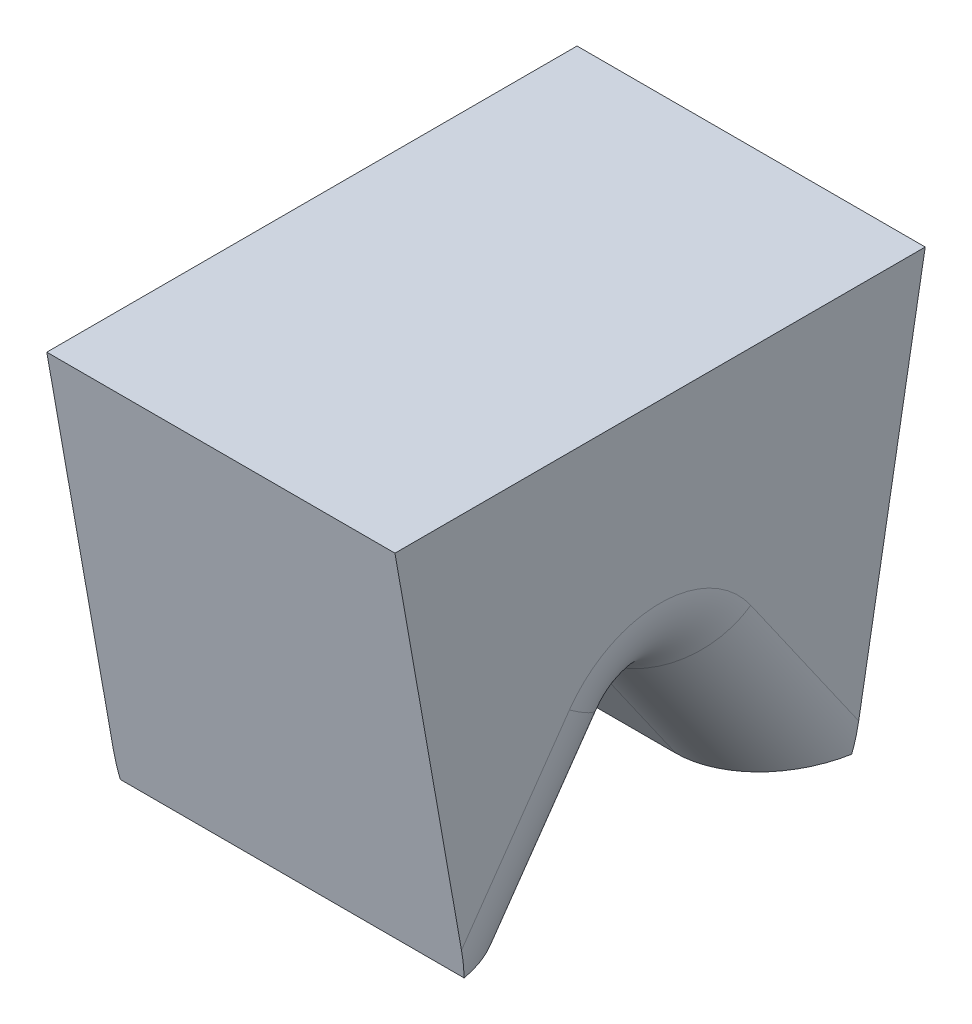
ISO-10303-21;
HEADER;
FILE_DESCRIPTION(('STEP AP214'),'2;1');
FILE_NAME('part.step','',(''),(''),'','','');
FILE_SCHEMA(('AUTOMOTIVE_DESIGN { 1 0 10303 214 1 1 1 1 }'));
ENDSEC;
DATA;
#1=APPLICATION_CONTEXT('core data for automotive mechanical design processes');
#2=APPLICATION_PROTOCOL_DEFINITION('international standard','automotive_design',2000,#1);
#3=PRODUCT_CONTEXT('',#1,'mechanical');
#4=PRODUCT('Part','Part','',(#3));
#5=PRODUCT_RELATED_PRODUCT_CATEGORY('part','',(#4));
#6=PRODUCT_DEFINITION_FORMATION('','',#4);
#7=PRODUCT_DEFINITION_CONTEXT('part definition',#1,'design');
#8=PRODUCT_DEFINITION('design','',#6,#7);
#9=PRODUCT_DEFINITION_SHAPE('','',#8);
#10=(LENGTH_UNIT() NAMED_UNIT(*) SI_UNIT(.MILLI.,.METRE.));
#11=(NAMED_UNIT(*) PLANE_ANGLE_UNIT() SI_UNIT($,.RADIAN.));
#12=(NAMED_UNIT(*) SI_UNIT($,.STERADIAN.) SOLID_ANGLE_UNIT());
#13=UNCERTAINTY_MEASURE_WITH_UNIT(LENGTH_MEASURE(1.E-05),#10,'distance_accuracy_value','');
#14=(GEOMETRIC_REPRESENTATION_CONTEXT(3) GLOBAL_UNCERTAINTY_ASSIGNED_CONTEXT((#13)) GLOBAL_UNIT_ASSIGNED_CONTEXT((#10,
#11,#12)) REPRESENTATION_CONTEXT('',''));
#15=CARTESIAN_POINT('',(0.,0.,0.));
#16=DIRECTION('',(0.,0.,1.));
#17=DIRECTION('',(1.,0.,0.));
#18=AXIS2_PLACEMENT_3D('',#15,#16,#17);
#19=CARTESIAN_POINT('',(0.,0.835526315789467,0.));
#20=DIRECTION('',(0.,1.,0.));
#21=DIRECTION('',(0.,0.,1.));
#22=AXIS2_PLACEMENT_3D('',#19,#20,#21);
#23=PLANE('',#22);
#24=DIRECTION('',(0.,0.,-1.));
#25=VECTOR('',#24,1.);
#26=CARTESIAN_POINT('',(-0.36068,0.835526315789467,1.50859998));
#27=LINE('',#26,#25);
#28=CARTESIAN_POINT('',(-0.36068,0.835526315789467,0.547375832565625));
#29=VERTEX_POINT('',#28);
#30=CARTESIAN_POINT('',(-0.36068,0.835526315789467,-0.547375832565625));
#31=VERTEX_POINT('',#30);
#32=EDGE_CURVE('E142',#29,#31,#27,.T.);
#33=ORIENTED_EDGE('',*,*,#32,.F.);
#34=DIRECTION('',(-1.,0.,0.));
#35=VECTOR('',#34,1.);
#36=CARTESIAN_POINT('',(1.50859998,0.835526315789467,0.547375832565625));
#37=LINE('',#36,#35);
#38=CARTESIAN_POINT('',(0.35814,0.835526315789467,0.547375832565625));
#39=VERTEX_POINT('',#38);
#40=EDGE_CURVE('E57',#39,#29,#37,.T.);
#41=ORIENTED_EDGE('',*,*,#40,.F.);
#42=DIRECTION('',(0.,0.,1.));
#43=VECTOR('',#42,1.);
#44=CARTESIAN_POINT('',(0.35814,0.835526315789467,1.50859998));
#45=LINE('',#44,#43);
#46=CARTESIAN_POINT('',(0.35814,0.835526315789467,-0.547375832565625));
#47=VERTEX_POINT('',#46);
#48=EDGE_CURVE('E12',#47,#39,#45,.T.);
#49=ORIENTED_EDGE('',*,*,#48,.F.);
#50=DIRECTION('',(1.,0.,0.));
#51=VECTOR('',#50,1.);
#52=CARTESIAN_POINT('',(1.50859998,0.835526315789467,-0.547375832565625));
#53=LINE('',#52,#51);
#54=EDGE_CURVE('E129',#31,#47,#53,.T.);
#55=ORIENTED_EDGE('',*,*,#54,.F.);
#56=EDGE_LOOP('',(#33,#41,#49,#55));
#57=FACE_BOUND('',#56,.T.);
#58=ADVANCED_FACE('F42',(#57),#23,.T.);
#59=CARTESIAN_POINT('',(1.50859998,0.,-0.40005));
#60=DIRECTION('',(0.,-0.173648177666931,-0.984807753012208));
#61=DIRECTION('',(0.,0.984807753012208,-0.173648177666931));
#62=AXIS2_PLACEMENT_3D('',#59,#60,#61);
#63=PLANE('',#62);
#64=DIRECTION('',(0.,0.984807753012208,-0.173648177666931));
#65=VECTOR('',#64,1.);
#66=CARTESIAN_POINT('',(-0.36068,0.,-0.40005));
#67=LINE('',#66,#65);
#68=CARTESIAN_POINT('',(-0.36068,0.0567663634848456,-0.410059441479082));
#69=VERTEX_POINT('',#68);
#70=EDGE_CURVE('E141',#69,#31,#67,.T.);
#71=ORIENTED_EDGE('',*,*,#70,.T.);
#72=ORIENTED_EDGE('',*,*,#54,.T.);
#73=DIRECTION('',(0.,-0.984807753012208,0.173648177666931));
#74=VECTOR('',#73,1.);
#75=CARTESIAN_POINT('',(0.35814,0.,-0.40005));
#76=LINE('',#75,#74);
#77=CARTESIAN_POINT('',(0.35814,0.0567663634848456,-0.410059441479082));
#78=VERTEX_POINT('',#77);
#79=EDGE_CURVE('E138',#47,#78,#76,.T.);
#80=ORIENTED_EDGE('',*,*,#79,.T.);
#81=CARTESIAN_POINT('',(0.17018,0.0567663634848455,-0.410059441479082));
#82=DIRECTION('',(0.,-0.173648177666931,-0.984807753012208));
#83=DIRECTION('',(0.,-0.984807753012208,0.173648177666931));
#84=AXIS2_PLACEMENT_3D('',#81,#82,#83);
#85=ELLIPSE('',#84,0.265815581183647,0.18796);
#86=CARTESIAN_POINT('',(0.353667484938324,0.,-0.40005));
#87=VERTEX_POINT('',#86);
#88=EDGE_CURVE('E250',#78,#87,#85,.T.);
#89=ORIENTED_EDGE('',*,*,#88,.T.);
#90=DIRECTION('',(-1.,0.,0.));
#91=VECTOR('',#90,1.);
#92=CARTESIAN_POINT('',(1.50859998,0.,-0.40005));
#93=LINE('',#92,#91);
#94=CARTESIAN_POINT('',(-0.356207484938324,0.,-0.40005));
#95=VERTEX_POINT('',#94);
#96=EDGE_CURVE('E157',#87,#95,#93,.T.);
#97=ORIENTED_EDGE('',*,*,#96,.T.);
#98=CARTESIAN_POINT('',(-0.17272,0.0567663634848455,-0.410059441479082));
#99=DIRECTION('',(0.,-0.173648177666931,-0.984807753012208));
#100=DIRECTION('',(0.,0.984807753012208,-0.173648177666931));
#101=AXIS2_PLACEMENT_3D('',#98,#99,#100);
#102=ELLIPSE('',#101,0.265815581183647,0.18796);
#103=EDGE_CURVE('E243',#95,#69,#102,.T.);
#104=ORIENTED_EDGE('',*,*,#103,.T.);
#105=EDGE_LOOP('',(#71,#72,#80,#89,#97,#104));
#106=FACE_BOUND('',#105,.T.);
#107=ADVANCED_FACE('F137',(#106),#63,.T.);
#108=CARTESIAN_POINT('',(1.50859998,0.,0.40005));
#109=DIRECTION('',(0.,-0.173648177666931,0.984807753012208));
#110=DIRECTION('',(0.,-0.984807753012208,-0.173648177666931));
#111=AXIS2_PLACEMENT_3D('',#108,#109,#110);
#112=PLANE('',#111);
#113=DIRECTION('',(0.,0.984807753012208,0.173648177666931));
#114=VECTOR('',#113,1.);
#115=CARTESIAN_POINT('',(0.35814,0.,0.40005));
#116=LINE('',#115,#114);
#117=CARTESIAN_POINT('',(0.35814,0.0567663634848455,0.410059441479082));
#118=VERTEX_POINT('',#117);
#119=EDGE_CURVE('E148',#118,#39,#116,.T.);
#120=ORIENTED_EDGE('',*,*,#119,.T.);
#121=ORIENTED_EDGE('',*,*,#40,.T.);
#122=DIRECTION('',(0.,-0.984807753012208,-0.173648177666931));
#123=VECTOR('',#122,1.);
#124=CARTESIAN_POINT('',(-0.36068,0.,0.40005));
#125=LINE('',#124,#123);
#126=CARTESIAN_POINT('',(-0.36068,0.0567663634848455,0.410059441479082));
#127=VERTEX_POINT('',#126);
#128=EDGE_CURVE('E159',#29,#127,#125,.T.);
#129=ORIENTED_EDGE('',*,*,#128,.T.);
#130=CARTESIAN_POINT('',(-0.17272,0.0567663634848455,0.410059441479082));
#131=DIRECTION('',(0.,-0.173648177666931,0.984807753012208));
#132=DIRECTION('',(0.,-0.984807753012208,-0.173648177666931));
#133=AXIS2_PLACEMENT_3D('',#130,#131,#132);
#134=ELLIPSE('',#133,0.265815581183647,0.18796);
#135=CARTESIAN_POINT('',(-0.356207484938324,0.,0.40005));
#136=VERTEX_POINT('',#135);
#137=EDGE_CURVE('E297',#127,#136,#134,.T.);
#138=ORIENTED_EDGE('',*,*,#137,.T.);
#139=DIRECTION('',(-1.,0.,0.));
#140=VECTOR('',#139,1.);
#141=CARTESIAN_POINT('',(1.50859998,0.,0.40005));
#142=LINE('',#141,#140);
#143=CARTESIAN_POINT('',(0.353667484938324,0.,0.40005));
#144=VERTEX_POINT('',#143);
#145=EDGE_CURVE('E150',#144,#136,#142,.T.);
#146=ORIENTED_EDGE('',*,*,#145,.F.);
#147=CARTESIAN_POINT('',(0.17018,0.0567663634848455,0.410059441479082));
#148=DIRECTION('',(0.,-0.173648177666931,0.984807753012208));
#149=DIRECTION('',(0.,0.984807753012208,0.173648177666931));
#150=AXIS2_PLACEMENT_3D('',#147,#148,#149);
#151=ELLIPSE('',#150,0.265815581183647,0.18796);
#152=EDGE_CURVE('E261',#144,#118,#151,.T.);
#153=ORIENTED_EDGE('',*,*,#152,.T.);
#154=EDGE_LOOP('',(#120,#121,#129,#138,#146,#153));
#155=FACE_BOUND('',#154,.T.);
#156=ADVANCED_FACE('F212',(#155),#112,.T.);
#157=CARTESIAN_POINT('',(-0.36068,1.02124002,1.50859998));
#158=DIRECTION('',(-1.,0.,0.));
#159=DIRECTION('',(0.,-1.,0.));
#160=AXIS2_PLACEMENT_3D('',#157,#158,#159);
#161=PLANE('',#160);
#162=ORIENTED_EDGE('',*,*,#128,.F.);
#163=ORIENTED_EDGE('',*,*,#32,.T.);
#164=ORIENTED_EDGE('',*,*,#70,.F.);
#165=DIRECTION('',(0.,-0.819152044288993,-0.573576436351044));
#166=VECTOR('',#165,1.);
#167=CARTESIAN_POINT('',(-0.36068,0.374959573349849,-0.187258157324464));
#168=LINE('',#167,#166);
#169=CARTESIAN_POINT('',(-0.36068,0.374959573349848,-0.187258157324464));
#170=VERTEX_POINT('',#169);
#171=EDGE_CURVE('E305',#69,#170,#168,.F.);
#172=ORIENTED_EDGE('',*,*,#171,.T.);
#173=CARTESIAN_POINT('',(-0.36068,0.24384,0.));
#174=DIRECTION('',(-1.,0.,0.));
#175=DIRECTION('',(0.,-1.,0.));
#176=AXIS2_PLACEMENT_3D('',#173,#174,#175);
#177=CIRCLE('',#176,0.2286);
#178=CARTESIAN_POINT('',(-0.36068,0.374959573349849,0.187258157324464));
#179=VERTEX_POINT('',#178);
#180=EDGE_CURVE('E303',#170,#179,#177,.F.);
#181=ORIENTED_EDGE('',*,*,#180,.T.);
#182=DIRECTION('',(0.,0.819152044288993,-0.573576436351044));
#183=VECTOR('',#182,1.);
#184=CARTESIAN_POINT('',(-0.36068,0.107809426976543,0.374318703648879));
#185=LINE('',#184,#183);
#186=EDGE_CURVE('E300',#179,#127,#185,.F.);
#187=ORIENTED_EDGE('',*,*,#186,.T.);
#188=EDGE_LOOP('',(#162,#163,#164,#172,#181,#187));
#189=FACE_BOUND('',#188,.T.);
#190=ADVANCED_FACE('F330',(#189),#161,.T.);
#191=CARTESIAN_POINT('',(0.35814,-0.00999998,1.50859998));
#192=DIRECTION('',(1.,0.,0.));
#193=DIRECTION('',(0.,1.,0.));
#194=AXIS2_PLACEMENT_3D('',#191,#192,#193);
#195=PLANE('',#194);
#196=ORIENTED_EDGE('',*,*,#79,.F.);
#197=ORIENTED_EDGE('',*,*,#48,.T.);
#198=ORIENTED_EDGE('',*,*,#119,.F.);
#199=DIRECTION('',(0.,-0.819152044288993,0.573576436351044));
#200=VECTOR('',#199,1.);
#201=CARTESIAN_POINT('',(0.35814,0.374959573349849,0.187258157324464));
#202=LINE('',#201,#200);
#203=CARTESIAN_POINT('',(0.35814,0.374959573349849,0.187258157324464));
#204=VERTEX_POINT('',#203);
#205=EDGE_CURVE('E247',#118,#204,#202,.F.);
#206=ORIENTED_EDGE('',*,*,#205,.T.);
#207=CARTESIAN_POINT('',(0.35814,0.24384,0.));
#208=DIRECTION('',(1.,0.,0.));
#209=DIRECTION('',(0.,1.,0.));
#210=AXIS2_PLACEMENT_3D('',#207,#208,#209);
#211=CIRCLE('',#210,0.2286);
#212=CARTESIAN_POINT('',(0.35814,0.374959573349849,-0.187258157324464));
#213=VERTEX_POINT('',#212);
#214=EDGE_CURVE('E242',#204,#213,#211,.F.);
#215=ORIENTED_EDGE('',*,*,#214,.T.);
#216=DIRECTION('',(0.,0.819152044288993,0.573576436351044));
#217=VECTOR('',#216,1.);
#218=CARTESIAN_POINT('',(0.35814,0.107809426976542,-0.37431870364888));
#219=LINE('',#218,#217);
#220=EDGE_CURVE('E146',#213,#78,#219,.F.);
#221=ORIENTED_EDGE('',*,*,#220,.T.);
#222=EDGE_LOOP('',(#196,#197,#198,#206,#215,#221));
#223=FACE_BOUND('',#222,.T.);
#224=ADVANCED_FACE('F144',(#223),#195,.T.);
#225=CARTESIAN_POINT('',(0.,0.,0.));
#226=DIRECTION('',(0.,1.,0.));
#227=DIRECTION('',(0.,0.,1.));
#228=AXIS2_PLACEMENT_3D('',#225,#226,#227);
#229=PLANE('',#228);
#230=ORIENTED_EDGE('',*,*,#96,.F.);
#231=CARTESIAN_POINT('',(0.17018,0.,-0.449807677107923));
#232=DIRECTION('',(0.,1.,0.));
#233=DIRECTION('',(0.,0.,-1.));
#234=AXIS2_PLACEMENT_3D('',#231,#232,#233);
#235=ELLIPSE('',#234,0.229456791703603,0.18796);
#236=CARTESIAN_POINT('',(0.17018,0.,-0.22035088540432));
#237=VERTEX_POINT('',#236);
#238=EDGE_CURVE('E252',#87,#237,#235,.F.);
#239=ORIENTED_EDGE('',*,*,#238,.T.);
#240=CARTESIAN_POINT('',(0.17018,0.,-0.22035088540432));
#241=DIRECTION('',(-1.,0.,0.));
#242=VECTOR('',#241,1.);
#243=LINE('',#240,#242);
#244=CARTESIAN_POINT('',(-0.17272,0.,-0.22035088540432));
#245=VERTEX_POINT('',#244);
#246=EDGE_CURVE('E237',#237,#245,#243,.T.);
#247=ORIENTED_EDGE('',*,*,#246,.T.);
#248=CARTESIAN_POINT('',(-0.17272,0.,-0.449807677107923));
#249=DIRECTION('',(0.,1.,0.));
#250=DIRECTION('',(0.,0.,1.));
#251=AXIS2_PLACEMENT_3D('',#248,#249,#250);
#252=ELLIPSE('',#251,0.229456791703603,0.18796);
#253=EDGE_CURVE('E282',#245,#95,#252,.F.);
#254=ORIENTED_EDGE('',*,*,#253,.T.);
#255=EDGE_LOOP('',(#230,#239,#247,#254));
#256=FACE_BOUND('',#255,.T.);
#257=ADVANCED_FACE('F180',(#256),#229,.F.);
#258=CARTESIAN_POINT('',(-0.172720000000001,0.,0.22035088540432));
#259=DIRECTION('',(1.,0.,0.));
#260=VECTOR('',#259,1.);
#261=LINE('',#258,#260);
#262=CARTESIAN_POINT('',(-0.172720000000001,0.,0.22035088540432));
#263=VERTEX_POINT('',#262);
#264=CARTESIAN_POINT('',(0.17018,0.,0.22035088540432));
#265=VERTEX_POINT('',#264);
#266=EDGE_CURVE('E161',#263,#265,#261,.T.);
#267=ORIENTED_EDGE('',*,*,#266,.T.);
#268=CARTESIAN_POINT('',(0.17018,0.,0.449807677107923));
#269=DIRECTION('',(0.,1.,0.));
#270=DIRECTION('',(0.,0.,-1.));
#271=AXIS2_PLACEMENT_3D('',#268,#269,#270);
#272=ELLIPSE('',#271,0.229456791703603,0.18796);
#273=EDGE_CURVE('E64',#265,#144,#272,.F.);
#274=ORIENTED_EDGE('',*,*,#273,.T.);
#275=ORIENTED_EDGE('',*,*,#145,.T.);
#276=CARTESIAN_POINT('',(-0.17272,0.,0.449807677107923));
#277=DIRECTION('',(0.,1.,0.));
#278=DIRECTION('',(0.,0.,1.));
#279=AXIS2_PLACEMENT_3D('',#276,#277,#278);
#280=ELLIPSE('',#279,0.229456791703603,0.18796);
#281=EDGE_CURVE('E293',#136,#263,#280,.F.);
#282=ORIENTED_EDGE('',*,*,#281,.T.);
#283=EDGE_LOOP('',(#267,#274,#275,#282));
#284=FACE_BOUND('',#283,.T.);
#285=ADVANCED_FACE('F169',(#284),#229,.F.);
#286=CARTESIAN_POINT('',(-1.20142,0.267150146373306,-0.0332903390799046));
#287=DIRECTION('',(0.,0.573576436351044,-0.819152044288993));
#288=DIRECTION('',(0.,0.819152044288993,0.573576436351044));
#289=AXIS2_PLACEMENT_3D('',#286,#287,#288);
#290=PLANE('',#289);
#291=ORIENTED_EDGE('',*,*,#246,.F.);
#292=DIRECTION('',(0.,0.819152044288993,0.573576436351044));
#293=VECTOR('',#292,1.);
#294=CARTESIAN_POINT('',(0.17018,0.267150146373306,-0.0332903390799047));
#295=LINE('',#294,#293);
#296=CARTESIAN_POINT('',(0.17018,0.267150146373306,-0.0332903390799046));
#297=VERTEX_POINT('',#296);
#298=EDGE_CURVE('E240',#237,#297,#295,.T.);
#299=ORIENTED_EDGE('',*,*,#298,.T.);
#300=DIRECTION('',(1.,0.,0.));
#301=VECTOR('',#300,1.);
#302=CARTESIAN_POINT('',(-1.20142,0.267150146373306,-0.0332903390799046));
#303=LINE('',#302,#301);
#304=CARTESIAN_POINT('',(-0.17272,0.267150146373306,-0.0332903390799046));
#305=VERTEX_POINT('',#304);
#306=EDGE_CURVE('E279',#305,#297,#303,.T.);
#307=ORIENTED_EDGE('',*,*,#306,.F.);
#308=DIRECTION('',(0.,-0.819152044288993,-0.573576436351044));
#309=VECTOR('',#308,1.);
#310=CARTESIAN_POINT('',(-0.17272,0.,-0.22035088540432));
#311=LINE('',#310,#309);
#312=EDGE_CURVE('E287',#305,#245,#311,.T.);
#313=ORIENTED_EDGE('',*,*,#312,.T.);
#314=EDGE_LOOP('',(#291,#299,#307,#313));
#315=FACE_BOUND('',#314,.T.);
#316=ADVANCED_FACE('F179',(#315),#290,.F.);
#317=CARTESIAN_POINT('',(-1.20142,-0.00999998000000014,0.227352946782267));
#318=DIRECTION('',(0.,0.573576436351044,0.819152044288993));
#319=DIRECTION('',(0.,-0.819152044288993,0.573576436351044));
#320=AXIS2_PLACEMENT_3D('',#317,#318,#319);
#321=PLANE('',#320);
#322=DIRECTION('',(1.,0.,0.));
#323=VECTOR('',#322,1.);
#324=CARTESIAN_POINT('',(-1.20142,0.267150146373306,0.0332903390799046));
#325=LINE('',#324,#323);
#326=CARTESIAN_POINT('',(-0.17272,0.267150146373306,0.0332903390799046));
#327=VERTEX_POINT('',#326);
#328=CARTESIAN_POINT('',(0.17018,0.267150146373306,0.0332903390799046));
#329=VERTEX_POINT('',#328);
#330=EDGE_CURVE('E152',#327,#329,#325,.T.);
#331=ORIENTED_EDGE('',*,*,#330,.T.);
#332=DIRECTION('',(0.,-0.819152044288993,0.573576436351044));
#333=VECTOR('',#332,1.);
#334=CARTESIAN_POINT('',(0.17018,0.,0.22035088540432));
#335=LINE('',#334,#333);
#336=EDGE_CURVE('E254',#329,#265,#335,.T.);
#337=ORIENTED_EDGE('',*,*,#336,.T.);
#338=ORIENTED_EDGE('',*,*,#266,.F.);
#339=DIRECTION('',(0.,0.819152044288993,-0.573576436351044));
#340=VECTOR('',#339,1.);
#341=CARTESIAN_POINT('',(-0.17272,0.267150146373307,0.0332903390799044));
#342=LINE('',#341,#340);
#343=EDGE_CURVE('E307',#263,#327,#342,.T.);
#344=ORIENTED_EDGE('',*,*,#343,.T.);
#345=EDGE_LOOP('',(#331,#337,#338,#344));
#346=FACE_BOUND('',#345,.T.);
#347=ADVANCED_FACE('F217',(#346),#321,.F.);
#348=CARTESIAN_POINT('',(-1.20142,0.24384,0.));
#349=DIRECTION('',(1.,0.,0.));
#350=DIRECTION('',(0.,0.,-1.));
#351=AXIS2_PLACEMENT_3D('',#348,#349,#350);
#352=CYLINDRICAL_SURFACE('',#351,0.0406399999999999);
#353=ORIENTED_EDGE('',*,*,#306,.T.);
#354=CARTESIAN_POINT('',(0.17018,0.24384,0.));
#355=DIRECTION('',(1.,0.,0.));
#356=DIRECTION('',(0.,1.,0.));
#357=AXIS2_PLACEMENT_3D('',#354,#355,#356);
#358=CIRCLE('',#357,0.0406399999999999);
#359=EDGE_CURVE('E50',#297,#329,#358,.T.);
#360=ORIENTED_EDGE('',*,*,#359,.T.);
#361=ORIENTED_EDGE('',*,*,#330,.F.);
#362=CARTESIAN_POINT('',(-0.17272,0.24384,0.));
#363=DIRECTION('',(-1.,0.,0.));
#364=DIRECTION('',(0.,-1.,0.));
#365=AXIS2_PLACEMENT_3D('',#362,#363,#364);
#366=CIRCLE('',#365,0.0406399999999999);
#367=EDGE_CURVE('E291',#327,#305,#366,.T.);
#368=ORIENTED_EDGE('',*,*,#367,.T.);
#369=EDGE_LOOP('',(#353,#360,#361,#368));
#370=FACE_BOUND('',#369,.T.);
#371=ADVANCED_FACE('F194',(#370),#352,.F.);
#372=CARTESIAN_POINT('',(-0.17272,0.374959573349849,-0.187258157324464));
#373=DIRECTION('',(0.,0.819152044288993,0.573576436351044));
#374=DIRECTION('',(0.,-0.573576436351044,0.819152044288993));
#375=AXIS2_PLACEMENT_3D('',#372,#373,#374);
#376=CYLINDRICAL_SURFACE('',#375,0.18796);
#377=ORIENTED_EDGE('',*,*,#253,.F.);
#378=ORIENTED_EDGE('',*,*,#312,.F.);
#379=CARTESIAN_POINT('',(-0.17272,0.374959573349848,-0.187258157324464));
#380=DIRECTION('',(0.,0.819152044288994,0.573576436351043));
#381=DIRECTION('',(0.,-0.573576436351043,0.819152044288994));
#382=AXIS2_PLACEMENT_3D('',#379,#380,#381);
#383=CIRCLE('',#382,0.18796);
#384=EDGE_CURVE('E272',#170,#305,#383,.T.);
#385=ORIENTED_EDGE('',*,*,#384,.F.);
#386=ORIENTED_EDGE('',*,*,#171,.F.);
#387=ORIENTED_EDGE('',*,*,#103,.F.);
#388=EDGE_LOOP('',(#377,#378,#385,#386,#387));
#389=FACE_BOUND('',#388,.T.);
#390=ADVANCED_FACE('F190',(#389),#376,.T.);
#391=CARTESIAN_POINT('',(-0.17272,0.24384,0.));
#392=DIRECTION('',(-1.,0.,0.));
#393=DIRECTION('',(0.,-1.,0.));
#394=AXIS2_PLACEMENT_3D('',#391,#392,#393);
#395=TOROIDAL_SURFACE('',#394,0.2286,0.18796);
#396=ORIENTED_EDGE('',*,*,#384,.T.);
#397=ORIENTED_EDGE('',*,*,#367,.F.);
#398=CARTESIAN_POINT('',(-0.17272,0.374959573349849,0.187258157324464));
#399=DIRECTION('',(0.,-0.819152044288993,0.573576436351044));
#400=DIRECTION('',(0.,-0.573576436351044,-0.819152044288993));
#401=AXIS2_PLACEMENT_3D('',#398,#399,#400);
#402=CIRCLE('',#401,0.18796);
#403=EDGE_CURVE('E268',#179,#327,#402,.T.);
#404=ORIENTED_EDGE('',*,*,#403,.F.);
#405=ORIENTED_EDGE('',*,*,#180,.F.);
#406=EDGE_LOOP('',(#396,#397,#404,#405));
#407=FACE_BOUND('',#406,.T.);
#408=ADVANCED_FACE('F186',(#407),#395,.T.);
#409=CARTESIAN_POINT('',(-0.17272,0.0978094469765422,0.381320765026826));
#410=DIRECTION('',(0.,-0.819152044288993,0.573576436351044));
#411=DIRECTION('',(0.,-0.573576436351044,-0.819152044288993));
#412=AXIS2_PLACEMENT_3D('',#409,#410,#411);
#413=CYLINDRICAL_SURFACE('',#412,0.18796);
#414=ORIENTED_EDGE('',*,*,#137,.F.);
#415=ORIENTED_EDGE('',*,*,#186,.F.);
#416=ORIENTED_EDGE('',*,*,#403,.T.);
#417=ORIENTED_EDGE('',*,*,#343,.F.);
#418=ORIENTED_EDGE('',*,*,#281,.F.);
#419=EDGE_LOOP('',(#414,#415,#416,#417,#418));
#420=FACE_BOUND('',#419,.T.);
#421=ADVANCED_FACE('F182',(#420),#413,.T.);
#422=CARTESIAN_POINT('',(0.17018,0.0978094469765421,0.381320765026826));
#423=DIRECTION('',(0.,0.819152044288993,-0.573576436351044));
#424=DIRECTION('',(0.,0.573576436351044,0.819152044288993));
#425=AXIS2_PLACEMENT_3D('',#422,#423,#424);
#426=CYLINDRICAL_SURFACE('',#425,0.18796);
#427=ORIENTED_EDGE('',*,*,#273,.F.);
#428=ORIENTED_EDGE('',*,*,#336,.F.);
#429=CARTESIAN_POINT('',(0.17018,0.374959573349849,0.187258157324464));
#430=DIRECTION('',(0.,0.819152044288993,-0.573576436351045));
#431=DIRECTION('',(0.,0.573576436351045,0.819152044288993));
#432=AXIS2_PLACEMENT_3D('',#429,#430,#431);
#433=CIRCLE('',#432,0.18796);
#434=EDGE_CURVE('E267',#204,#329,#433,.T.);
#435=ORIENTED_EDGE('',*,*,#434,.F.);
#436=ORIENTED_EDGE('',*,*,#205,.F.);
#437=ORIENTED_EDGE('',*,*,#152,.F.);
#438=EDGE_LOOP('',(#427,#428,#435,#436,#437));
#439=FACE_BOUND('',#438,.T.);
#440=ADVANCED_FACE('F44',(#439),#426,.T.);
#441=CARTESIAN_POINT('',(0.17018,0.24384,0.));
#442=DIRECTION('',(1.,0.,0.));
#443=DIRECTION('',(0.,1.,0.));
#444=AXIS2_PLACEMENT_3D('',#441,#442,#443);
#445=TOROIDAL_SURFACE('',#444,0.2286,0.18796);
#446=ORIENTED_EDGE('',*,*,#434,.T.);
#447=ORIENTED_EDGE('',*,*,#359,.F.);
#448=CARTESIAN_POINT('',(0.17018,0.374959573349849,-0.187258157324464));
#449=DIRECTION('',(0.,-0.819152044288993,-0.573576436351044));
#450=DIRECTION('',(0.,0.573576436351044,-0.819152044288993));
#451=AXIS2_PLACEMENT_3D('',#448,#449,#450);
#452=CIRCLE('',#451,0.18796);
#453=EDGE_CURVE('E266',#213,#297,#452,.T.);
#454=ORIENTED_EDGE('',*,*,#453,.F.);
#455=ORIENTED_EDGE('',*,*,#214,.F.);
#456=EDGE_LOOP('',(#446,#447,#454,#455));
#457=FACE_BOUND('',#456,.T.);
#458=ADVANCED_FACE('F198',(#457),#445,.T.);
#459=CARTESIAN_POINT('',(0.17018,0.374959573349849,-0.187258157324464));
#460=DIRECTION('',(0.,-0.819152044288993,-0.573576436351044));
#461=DIRECTION('',(0.,0.573576436351044,-0.819152044288993));
#462=AXIS2_PLACEMENT_3D('',#459,#460,#461);
#463=CYLINDRICAL_SURFACE('',#462,0.18796);
#464=ORIENTED_EDGE('',*,*,#88,.F.);
#465=ORIENTED_EDGE('',*,*,#220,.F.);
#466=ORIENTED_EDGE('',*,*,#453,.T.);
#467=ORIENTED_EDGE('',*,*,#298,.F.);
#468=ORIENTED_EDGE('',*,*,#238,.F.);
#469=EDGE_LOOP('',(#464,#465,#466,#467,#468));
#470=FACE_BOUND('',#469,.T.);
#471=ADVANCED_FACE('F196',(#470),#463,.T.);
#472=CLOSED_SHELL('',(#58,#107,#156,#190,#224,#257,#285,#316,#347,#371,#390,#408,#421,#440,#458,#471));
#473=MANIFOLD_SOLID_BREP('B2',#472);
#474=ADVANCED_BREP_SHAPE_REPRESENTATION('',(#18,#473),#14);
#475=SHAPE_DEFINITION_REPRESENTATION(#9,#474);
ENDSEC;
END-ISO-10303-21;
